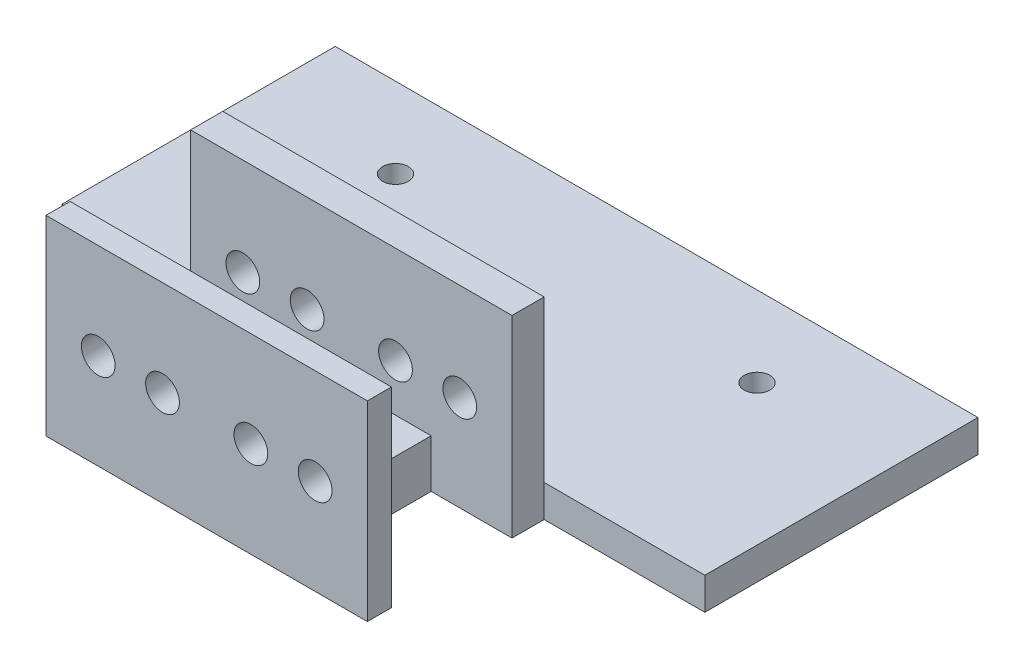
ISO-10303-21;
HEADER;
FILE_DESCRIPTION(('STEP AP214'),'2;1');
FILE_NAME('part.step','',(''),(''),'','','');
FILE_SCHEMA(('AUTOMOTIVE_DESIGN { 1 0 10303 214 1 1 1 1 }'));
ENDSEC;
DATA;
#1=APPLICATION_CONTEXT('core data for automotive mechanical design processes');
#2=APPLICATION_PROTOCOL_DEFINITION('international standard','automotive_design',2000,#1);
#3=PRODUCT_CONTEXT('',#1,'mechanical');
#4=PRODUCT('Part','Part','',(#3));
#5=PRODUCT_RELATED_PRODUCT_CATEGORY('part','',(#4));
#6=PRODUCT_DEFINITION_FORMATION('','',#4);
#7=PRODUCT_DEFINITION_CONTEXT('part definition',#1,'design');
#8=PRODUCT_DEFINITION('design','',#6,#7);
#9=PRODUCT_DEFINITION_SHAPE('','',#8);
#10=(LENGTH_UNIT() NAMED_UNIT(*) SI_UNIT(.MILLI.,.METRE.));
#11=(NAMED_UNIT(*) PLANE_ANGLE_UNIT() SI_UNIT($,.RADIAN.));
#12=(NAMED_UNIT(*) SI_UNIT($,.STERADIAN.) SOLID_ANGLE_UNIT());
#13=UNCERTAINTY_MEASURE_WITH_UNIT(LENGTH_MEASURE(1.E-05),#10,'distance_accuracy_value','');
#14=(GEOMETRIC_REPRESENTATION_CONTEXT(3) GLOBAL_UNCERTAINTY_ASSIGNED_CONTEXT((#13)) GLOBAL_UNIT_ASSIGNED_CONTEXT((#10,
#11,#12)) REPRESENTATION_CONTEXT('',''));
#15=CARTESIAN_POINT('',(0.,0.,0.));
#16=DIRECTION('',(0.,0.,1.));
#17=DIRECTION('',(1.,0.,0.));
#18=AXIS2_PLACEMENT_3D('',#15,#16,#17);
#19=CARTESIAN_POINT('',(0.,0.,21.));
#20=DIRECTION('',(0.,0.,-1.));
#21=DIRECTION('',(-1.,0.,0.));
#22=AXIS2_PLACEMENT_3D('',#19,#20,#21);
#23=PLANE('',#22);
#24=CARTESIAN_POINT('',(-13.5,11.8953133982025,21.));
#25=DIRECTION('',(0.,0.,-1.));
#26=DIRECTION('',(-1.,0.,0.));
#27=AXIS2_PLACEMENT_3D('',#24,#25,#26);
#28=CIRCLE('',#27,2.1);
#29=CARTESIAN_POINT('',(-15.6,11.8953133982025,21.));
#30=VERTEX_POINT('',#29);
#31=EDGE_CURVE('E317',#30,#30,#28,.T.);
#32=ORIENTED_EDGE('',*,*,#31,.T.);
#33=EDGE_LOOP('',(#32));
#34=FACE_BOUND('',#33,.T.);
#35=CARTESIAN_POINT('',(-5.50000000000001,11.8953133982025,21.));
#36=DIRECTION('',(0.,0.,-1.));
#37=DIRECTION('',(-1.,0.,0.));
#38=AXIS2_PLACEMENT_3D('',#35,#36,#37);
#39=CIRCLE('',#38,2.1);
#40=CARTESIAN_POINT('',(-7.60000000000001,11.8953133982025,21.));
#41=VERTEX_POINT('',#40);
#42=EDGE_CURVE('E305',#41,#41,#39,.T.);
#43=ORIENTED_EDGE('',*,*,#42,.T.);
#44=EDGE_LOOP('',(#43));
#45=FACE_BOUND('',#44,.T.);
#46=CARTESIAN_POINT('',(5.49999999999999,11.8953133982025,21.));
#47=DIRECTION('',(0.,0.,-1.));
#48=DIRECTION('',(-1.,0.,0.));
#49=AXIS2_PLACEMENT_3D('',#46,#47,#48);
#50=CIRCLE('',#49,2.1);
#51=CARTESIAN_POINT('',(3.39999999999999,11.8953133982025,21.));
#52=VERTEX_POINT('',#51);
#53=EDGE_CURVE('E302',#52,#52,#50,.T.);
#54=ORIENTED_EDGE('',*,*,#53,.T.);
#55=EDGE_LOOP('',(#54));
#56=FACE_BOUND('',#55,.T.);
#57=CARTESIAN_POINT('',(13.5,11.8953133982025,21.));
#58=DIRECTION('',(0.,0.,-1.));
#59=DIRECTION('',(-1.,0.,0.));
#60=AXIS2_PLACEMENT_3D('',#57,#58,#59);
#61=CIRCLE('',#60,2.1);
#62=CARTESIAN_POINT('',(11.4,11.8953133982025,21.));
#63=VERTEX_POINT('',#62);
#64=EDGE_CURVE('E298',#63,#63,#61,.T.);
#65=ORIENTED_EDGE('',*,*,#64,.T.);
#66=EDGE_LOOP('',(#65));
#67=FACE_BOUND('',#66,.T.);
#68=DIRECTION('',(0.,1.,0.));
#69=VECTOR('',#68,1.);
#70=CARTESIAN_POINT('',(9.93801246310932,6.,21.));
#71=LINE('',#70,#69);
#72=CARTESIAN_POINT('',(9.93801246310932,0.,21.));
#73=VERTEX_POINT('',#72);
#74=CARTESIAN_POINT('',(9.93801246310932,6.,21.));
#75=VERTEX_POINT('',#74);
#76=EDGE_CURVE('E66',#73,#75,#71,.T.);
#77=ORIENTED_EDGE('',*,*,#76,.F.);
#78=DIRECTION('',(1.,0.,0.));
#79=VECTOR('',#78,1.);
#80=CARTESIAN_POINT('',(-20.,0.,21.));
#81=LINE('',#80,#79);
#82=CARTESIAN_POINT('',(20.,0.,21.));
#83=VERTEX_POINT('',#82);
#84=EDGE_CURVE('E224',#73,#83,#81,.T.);
#85=ORIENTED_EDGE('',*,*,#84,.T.);
#86=DIRECTION('',(0.,1.,0.));
#87=VECTOR('',#86,1.);
#88=CARTESIAN_POINT('',(20.,0.,21.));
#89=LINE('',#88,#87);
#90=CARTESIAN_POINT('',(20.,24.,21.));
#91=VERTEX_POINT('',#90);
#92=EDGE_CURVE('E228',#83,#91,#89,.T.);
#93=ORIENTED_EDGE('',*,*,#92,.T.);
#94=DIRECTION('',(-1.,0.,0.));
#95=VECTOR('',#94,1.);
#96=CARTESIAN_POINT('',(-20.,24.,21.));
#97=LINE('',#96,#95);
#98=CARTESIAN_POINT('',(-20.,24.,21.));
#99=VERTEX_POINT('',#98);
#100=EDGE_CURVE('E230',#91,#99,#97,.T.);
#101=ORIENTED_EDGE('',*,*,#100,.T.);
#102=DIRECTION('',(0.,-1.,0.));
#103=VECTOR('',#102,1.);
#104=CARTESIAN_POINT('',(-20.,0.,21.));
#105=LINE('',#104,#103);
#106=CARTESIAN_POINT('',(-20.,0.,21.));
#107=VERTEX_POINT('',#106);
#108=EDGE_CURVE('E221',#99,#107,#105,.T.);
#109=ORIENTED_EDGE('',*,*,#108,.T.);
#110=CARTESIAN_POINT('',(-10.0619875368907,0.,21.));
#111=VERTEX_POINT('',#110);
#112=EDGE_CURVE('E226',#107,#111,#81,.T.);
#113=ORIENTED_EDGE('',*,*,#112,.T.);
#114=DIRECTION('',(0.,-1.,0.));
#115=VECTOR('',#114,1.);
#116=CARTESIAN_POINT('',(-10.0619875368907,6.,21.));
#117=LINE('',#116,#115);
#118=CARTESIAN_POINT('',(-10.0619875368907,6.,21.));
#119=VERTEX_POINT('',#118);
#120=EDGE_CURVE('E201',#119,#111,#117,.T.);
#121=ORIENTED_EDGE('',*,*,#120,.F.);
#122=DIRECTION('',(-1.,0.,0.));
#123=VECTOR('',#122,1.);
#124=CARTESIAN_POINT('',(-10.0619875368907,6.,21.));
#125=LINE('',#124,#123);
#126=EDGE_CURVE('E61',#75,#119,#125,.T.);
#127=ORIENTED_EDGE('',*,*,#126,.F.);
#128=EDGE_LOOP('',(#77,#85,#93,#101,#109,#113,#121,#127));
#129=FACE_BOUND('',#128,.T.);
#130=ADVANCED_FACE('F43',(#34,#45,#56,#67,#129),#23,.F.);
#131=CARTESIAN_POINT('',(-40.,4.,17.));
#132=DIRECTION('',(0.,0.,-1.));
#133=DIRECTION('',(-1.,0.,0.));
#134=AXIS2_PLACEMENT_3D('',#131,#132,#133);
#135=PLANE('',#134);
#136=DIRECTION('',(0.,-1.,0.));
#137=VECTOR('',#136,1.);
#138=CARTESIAN_POINT('',(-20.,0.,17.));
#139=LINE('',#138,#137);
#140=CARTESIAN_POINT('',(-20.,4.,17.));
#141=VERTEX_POINT('',#140);
#142=CARTESIAN_POINT('',(-20.,0.,17.));
#143=VERTEX_POINT('',#142);
#144=EDGE_CURVE('E11',#141,#143,#139,.T.);
#145=ORIENTED_EDGE('',*,*,#144,.F.);
#146=DIRECTION('',(1.,0.,0.));
#147=VECTOR('',#146,1.);
#148=CARTESIAN_POINT('',(-40.,4.,17.));
#149=LINE('',#148,#147);
#150=CARTESIAN_POINT('',(-40.,4.,17.));
#151=VERTEX_POINT('',#150);
#152=EDGE_CURVE('E272',#151,#141,#149,.T.);
#153=ORIENTED_EDGE('',*,*,#152,.F.);
#154=DIRECTION('',(0.,-1.,0.));
#155=VECTOR('',#154,1.);
#156=CARTESIAN_POINT('',(-40.,4.,17.));
#157=LINE('',#156,#155);
#158=CARTESIAN_POINT('',(-40.,0.,17.));
#159=VERTEX_POINT('',#158);
#160=EDGE_CURVE('E287',#151,#159,#157,.T.);
#161=ORIENTED_EDGE('',*,*,#160,.T.);
#162=DIRECTION('',(1.,0.,0.));
#163=VECTOR('',#162,1.);
#164=CARTESIAN_POINT('',(-40.,0.,17.));
#165=LINE('',#164,#163);
#166=EDGE_CURVE('E267',#159,#143,#165,.T.);
#167=ORIENTED_EDGE('',*,*,#166,.T.);
#168=EDGE_LOOP('',(#145,#153,#161,#167));
#169=FACE_BOUND('',#168,.T.);
#170=ADVANCED_FACE('F369',(#169),#135,.F.);
#171=DIRECTION('',(0.,1.,0.));
#172=VECTOR('',#171,1.);
#173=CARTESIAN_POINT('',(20.,0.,17.));
#174=LINE('',#173,#172);
#175=CARTESIAN_POINT('',(20.,0.,17.));
#176=VERTEX_POINT('',#175);
#177=CARTESIAN_POINT('',(20.,4.,17.));
#178=VERTEX_POINT('',#177);
#179=EDGE_CURVE('E235',#176,#178,#174,.T.);
#180=ORIENTED_EDGE('',*,*,#179,.F.);
#181=CARTESIAN_POINT('',(40.,0.,17.));
#182=VERTEX_POINT('',#181);
#183=EDGE_CURVE('E283',#176,#182,#165,.T.);
#184=ORIENTED_EDGE('',*,*,#183,.T.);
#185=DIRECTION('',(0.,-1.,0.));
#186=VECTOR('',#185,1.);
#187=CARTESIAN_POINT('',(40.,4.,17.));
#188=LINE('',#187,#186);
#189=CARTESIAN_POINT('',(40.,4.,17.));
#190=VERTEX_POINT('',#189);
#191=EDGE_CURVE('E275',#190,#182,#188,.T.);
#192=ORIENTED_EDGE('',*,*,#191,.F.);
#193=EDGE_CURVE('E271',#178,#190,#149,.T.);
#194=ORIENTED_EDGE('',*,*,#193,.F.);
#195=EDGE_LOOP('',(#180,#184,#192,#194));
#196=FACE_BOUND('',#195,.T.);
#197=ADVANCED_FACE('F384',(#196),#135,.F.);
#198=CARTESIAN_POINT('',(40.,4.,-17.));
#199=DIRECTION('',(-1.,0.,0.));
#200=DIRECTION('',(0.,0.,1.));
#201=AXIS2_PLACEMENT_3D('',#198,#199,#200);
#202=PLANE('',#201);
#203=DIRECTION('',(0.,0.,-1.));
#204=VECTOR('',#203,1.);
#205=CARTESIAN_POINT('',(40.,0.,-17.));
#206=LINE('',#205,#204);
#207=CARTESIAN_POINT('',(40.,0.,-17.));
#208=VERTEX_POINT('',#207);
#209=EDGE_CURVE('E258',#182,#208,#206,.T.);
#210=ORIENTED_EDGE('',*,*,#209,.T.);
#211=DIRECTION('',(0.,-1.,0.));
#212=VECTOR('',#211,1.);
#213=CARTESIAN_POINT('',(40.,4.,-17.));
#214=LINE('',#213,#212);
#215=CARTESIAN_POINT('',(40.,4.,-17.));
#216=VERTEX_POINT('',#215);
#217=EDGE_CURVE('E52',#216,#208,#214,.T.);
#218=ORIENTED_EDGE('',*,*,#217,.F.);
#219=DIRECTION('',(0.,0.,-1.));
#220=VECTOR('',#219,1.);
#221=CARTESIAN_POINT('',(40.,4.,-17.));
#222=LINE('',#221,#220);
#223=EDGE_CURVE('E263',#190,#216,#222,.T.);
#224=ORIENTED_EDGE('',*,*,#223,.F.);
#225=ORIENTED_EDGE('',*,*,#191,.T.);
#226=EDGE_LOOP('',(#210,#218,#224,#225));
#227=FACE_BOUND('',#226,.T.);
#228=ADVANCED_FACE('F45',(#227),#202,.F.);
#229=CARTESIAN_POINT('',(-40.,4.,-17.));
#230=DIRECTION('',(0.,0.,1.));
#231=DIRECTION('',(1.,0.,0.));
#232=AXIS2_PLACEMENT_3D('',#229,#230,#231);
#233=PLANE('',#232);
#234=DIRECTION('',(-1.,0.,0.));
#235=VECTOR('',#234,1.);
#236=CARTESIAN_POINT('',(-40.,0.,-17.));
#237=LINE('',#236,#235);
#238=CARTESIAN_POINT('',(-40.,0.,-17.));
#239=VERTEX_POINT('',#238);
#240=EDGE_CURVE('E279',#208,#239,#237,.T.);
#241=ORIENTED_EDGE('',*,*,#240,.T.);
#242=DIRECTION('',(0.,-1.,0.));
#243=VECTOR('',#242,1.);
#244=CARTESIAN_POINT('',(-40.,4.,-17.));
#245=LINE('',#244,#243);
#246=CARTESIAN_POINT('',(-40.,4.,-17.));
#247=VERTEX_POINT('',#246);
#248=EDGE_CURVE('E290',#247,#239,#245,.T.);
#249=ORIENTED_EDGE('',*,*,#248,.F.);
#250=DIRECTION('',(-1.,0.,0.));
#251=VECTOR('',#250,1.);
#252=CARTESIAN_POINT('',(-40.,4.,-17.));
#253=LINE('',#252,#251);
#254=EDGE_CURVE('E266',#216,#247,#253,.T.);
#255=ORIENTED_EDGE('',*,*,#254,.F.);
#256=ORIENTED_EDGE('',*,*,#217,.T.);
#257=EDGE_LOOP('',(#241,#249,#255,#256));
#258=FACE_BOUND('',#257,.T.);
#259=ADVANCED_FACE('F377',(#258),#233,.F.);
#260=CARTESIAN_POINT('',(-40.,4.,-17.));
#261=DIRECTION('',(1.,0.,0.));
#262=DIRECTION('',(0.,0.,-1.));
#263=AXIS2_PLACEMENT_3D('',#260,#261,#262);
#264=PLANE('',#263);
#265=DIRECTION('',(0.,0.,1.));
#266=VECTOR('',#265,1.);
#267=CARTESIAN_POINT('',(-40.,0.,-17.));
#268=LINE('',#267,#266);
#269=EDGE_CURVE('E281',#239,#159,#268,.T.);
#270=ORIENTED_EDGE('',*,*,#269,.T.);
#271=ORIENTED_EDGE('',*,*,#160,.F.);
#272=DIRECTION('',(0.,0.,1.));
#273=VECTOR('',#272,1.);
#274=CARTESIAN_POINT('',(-40.,4.,-17.));
#275=LINE('',#274,#273);
#276=EDGE_CURVE('E269',#247,#151,#275,.T.);
#277=ORIENTED_EDGE('',*,*,#276,.F.);
#278=ORIENTED_EDGE('',*,*,#248,.T.);
#279=EDGE_LOOP('',(#270,#271,#277,#278));
#280=FACE_BOUND('',#279,.T.);
#281=ADVANCED_FACE('F374',(#280),#264,.F.);
#282=CARTESIAN_POINT('',(0.,4.,0.));
#283=DIRECTION('',(0.,1.,0.));
#284=DIRECTION('',(0.,0.,1.));
#285=AXIS2_PLACEMENT_3D('',#282,#283,#284);
#286=PLANE('',#285);
#287=CARTESIAN_POINT('',(-22.5,4.,-7.00000000000001));
#288=DIRECTION('',(0.,1.,0.));
#289=DIRECTION('',(0.,0.,1.));
#290=AXIS2_PLACEMENT_3D('',#287,#288,#289);
#291=CIRCLE('',#290,1.6);
#292=CARTESIAN_POINT('',(-22.5,4.,-5.4));
#293=VERTEX_POINT('',#292);
#294=EDGE_CURVE('E251',#293,#293,#291,.T.);
#295=ORIENTED_EDGE('',*,*,#294,.F.);
#296=EDGE_LOOP('',(#295));
#297=FACE_BOUND('',#296,.T.);
#298=CARTESIAN_POINT('',(22.5,4.,-7.00000000000001));
#299=DIRECTION('',(0.,1.,0.));
#300=DIRECTION('',(0.,0.,1.));
#301=AXIS2_PLACEMENT_3D('',#298,#299,#300);
#302=CIRCLE('',#301,1.6);
#303=CARTESIAN_POINT('',(22.5,4.,-5.4));
#304=VERTEX_POINT('',#303);
#305=EDGE_CURVE('E255',#304,#304,#302,.T.);
#306=ORIENTED_EDGE('',*,*,#305,.F.);
#307=EDGE_LOOP('',(#306));
#308=FACE_BOUND('',#307,.T.);
#309=ORIENTED_EDGE('',*,*,#223,.T.);
#310=ORIENTED_EDGE('',*,*,#254,.T.);
#311=ORIENTED_EDGE('',*,*,#276,.T.);
#312=ORIENTED_EDGE('',*,*,#152,.T.);
#313=EDGE_CURVE('E276',#141,#178,#149,.T.);
#314=ORIENTED_EDGE('',*,*,#313,.T.);
#315=ORIENTED_EDGE('',*,*,#193,.T.);
#316=EDGE_LOOP('',(#309,#310,#311,#312,#314,#315));
#317=FACE_BOUND('',#316,.T.);
#318=ADVANCED_FACE('F389',(#297,#308,#317),#286,.T.);
#319=CARTESIAN_POINT('',(0.,0.,0.));
#320=DIRECTION('',(0.,1.,0.));
#321=DIRECTION('',(0.,0.,1.));
#322=AXIS2_PLACEMENT_3D('',#319,#320,#321);
#323=PLANE('',#322);
#324=CARTESIAN_POINT('',(-22.5,0.,-7.00000000000001));
#325=DIRECTION('',(0.,1.,0.));
#326=DIRECTION('',(0.,0.,1.));
#327=AXIS2_PLACEMENT_3D('',#324,#325,#326);
#328=CIRCLE('',#327,1.6);
#329=CARTESIAN_POINT('',(-22.5,0.,-5.4));
#330=VERTEX_POINT('',#329);
#331=EDGE_CURVE('E254',#330,#330,#328,.F.);
#332=ORIENTED_EDGE('',*,*,#331,.F.);
#333=EDGE_LOOP('',(#332));
#334=FACE_BOUND('',#333,.T.);
#335=CARTESIAN_POINT('',(22.5,0.,-7.00000000000001));
#336=DIRECTION('',(0.,1.,0.));
#337=DIRECTION('',(0.,0.,1.));
#338=AXIS2_PLACEMENT_3D('',#335,#336,#337);
#339=CIRCLE('',#338,1.6);
#340=CARTESIAN_POINT('',(22.5,0.,-5.4));
#341=VERTEX_POINT('',#340);
#342=EDGE_CURVE('E250',#341,#341,#339,.F.);
#343=ORIENTED_EDGE('',*,*,#342,.F.);
#344=EDGE_LOOP('',(#343));
#345=FACE_BOUND('',#344,.T.);
#346=ORIENTED_EDGE('',*,*,#209,.F.);
#347=ORIENTED_EDGE('',*,*,#183,.F.);
#348=DIRECTION('',(0.,0.,-1.));
#349=VECTOR('',#348,1.);
#350=CARTESIAN_POINT('',(20.,0.,21.));
#351=LINE('',#350,#349);
#352=EDGE_CURVE('E244',#83,#176,#351,.T.);
#353=ORIENTED_EDGE('',*,*,#352,.F.);
#354=ORIENTED_EDGE('',*,*,#84,.F.);
#355=DIRECTION('',(0.,0.,-1.));
#356=VECTOR('',#355,1.);
#357=CARTESIAN_POINT('',(9.93801246310932,0.,36.));
#358=LINE('',#357,#356);
#359=CARTESIAN_POINT('',(9.93801246310932,0.,36.));
#360=VERTEX_POINT('',#359);
#361=EDGE_CURVE('E206',#360,#73,#358,.T.);
#362=ORIENTED_EDGE('',*,*,#361,.F.);
#363=DIRECTION('',(1.,0.,0.));
#364=VECTOR('',#363,1.);
#365=CARTESIAN_POINT('',(-20.,0.,36.));
#366=LINE('',#365,#364);
#367=CARTESIAN_POINT('',(20.,0.,36.));
#368=VERTEX_POINT('',#367);
#369=EDGE_CURVE('E324',#360,#368,#366,.T.);
#370=ORIENTED_EDGE('',*,*,#369,.T.);
#371=DIRECTION('',(0.,0.,-1.));
#372=VECTOR('',#371,1.);
#373=CARTESIAN_POINT('',(20.,0.,39.));
#374=LINE('',#373,#372);
#375=CARTESIAN_POINT('',(20.,0.,39.));
#376=VERTEX_POINT('',#375);
#377=EDGE_CURVE('E173',#376,#368,#374,.T.);
#378=ORIENTED_EDGE('',*,*,#377,.F.);
#379=DIRECTION('',(1.,0.,0.));
#380=VECTOR('',#379,1.);
#381=CARTESIAN_POINT('',(-20.,0.,39.));
#382=LINE('',#381,#380);
#383=CARTESIAN_POINT('',(-20.,0.,39.));
#384=VERTEX_POINT('',#383);
#385=EDGE_CURVE('E164',#384,#376,#382,.T.);
#386=ORIENTED_EDGE('',*,*,#385,.F.);
#387=DIRECTION('',(0.,0.,-1.));
#388=VECTOR('',#387,1.);
#389=CARTESIAN_POINT('',(-20.,0.,39.));
#390=LINE('',#389,#388);
#391=CARTESIAN_POINT('',(-20.,0.,36.));
#392=VERTEX_POINT('',#391);
#393=EDGE_CURVE('E170',#384,#392,#390,.T.);
#394=ORIENTED_EDGE('',*,*,#393,.T.);
#395=CARTESIAN_POINT('',(-10.0619875368907,0.,36.));
#396=VERTEX_POINT('',#395);
#397=EDGE_CURVE('E325',#392,#396,#366,.T.);
#398=ORIENTED_EDGE('',*,*,#397,.T.);
#399=DIRECTION('',(0.,0.,-1.));
#400=VECTOR('',#399,1.);
#401=CARTESIAN_POINT('',(-10.0619875368907,0.,36.));
#402=LINE('',#401,#400);
#403=EDGE_CURVE('E213',#396,#111,#402,.T.);
#404=ORIENTED_EDGE('',*,*,#403,.T.);
#405=ORIENTED_EDGE('',*,*,#112,.F.);
#406=DIRECTION('',(0.,0.,-1.));
#407=VECTOR('',#406,1.);
#408=CARTESIAN_POINT('',(-20.,0.,21.));
#409=LINE('',#408,#407);
#410=EDGE_CURVE('E247',#107,#143,#409,.T.);
#411=ORIENTED_EDGE('',*,*,#410,.T.);
#412=ORIENTED_EDGE('',*,*,#166,.F.);
#413=ORIENTED_EDGE('',*,*,#269,.F.);
#414=ORIENTED_EDGE('',*,*,#240,.F.);
#415=EDGE_LOOP('',(#346,#347,#353,#354,#362,#370,#378,#386,#394,#398,#404,#405,#411,#412,#413,#414));
#416=FACE_BOUND('',#415,.T.);
#417=ADVANCED_FACE('F167',(#334,#345,#416),#323,.F.);
#418=CARTESIAN_POINT('',(22.5,-0.00100000000000013,-7.00000000000001));
#419=DIRECTION('',(0.,1.,0.));
#420=DIRECTION('',(0.,0.,1.));
#421=AXIS2_PLACEMENT_3D('',#418,#419,#420);
#422=CYLINDRICAL_SURFACE('',#421,1.6);
#423=ORIENTED_EDGE('',*,*,#305,.T.);
#424=EDGE_LOOP('',(#423));
#425=FACE_BOUND('',#424,.T.);
#426=ORIENTED_EDGE('',*,*,#342,.T.);
#427=EDGE_LOOP('',(#426));
#428=FACE_BOUND('',#427,.T.);
#429=ADVANCED_FACE('F398',(#425,#428),#422,.F.);
#430=CARTESIAN_POINT('',(-22.5,-0.00100000000000013,-7.00000000000001));
#431=DIRECTION('',(0.,1.,0.));
#432=DIRECTION('',(0.,0.,1.));
#433=AXIS2_PLACEMENT_3D('',#430,#431,#432);
#434=CYLINDRICAL_SURFACE('',#433,1.6);
#435=ORIENTED_EDGE('',*,*,#294,.T.);
#436=EDGE_LOOP('',(#435));
#437=FACE_BOUND('',#436,.T.);
#438=ORIENTED_EDGE('',*,*,#331,.T.);
#439=EDGE_LOOP('',(#438));
#440=FACE_BOUND('',#439,.T.);
#441=ADVANCED_FACE('F420',(#437,#440),#434,.F.);
#442=CARTESIAN_POINT('',(0.,0.,17.));
#443=DIRECTION('',(0.,0.,-1.));
#444=DIRECTION('',(-1.,0.,0.));
#445=AXIS2_PLACEMENT_3D('',#442,#443,#444);
#446=PLANE('',#445);
#447=CARTESIAN_POINT('',(-13.5,11.8953133982025,17.));
#448=DIRECTION('',(0.,0.,-1.));
#449=DIRECTION('',(-1.,0.,0.));
#450=AXIS2_PLACEMENT_3D('',#447,#448,#449);
#451=CIRCLE('',#450,2.1);
#452=CARTESIAN_POINT('',(-15.6,11.8953133982025,17.));
#453=VERTEX_POINT('',#452);
#454=EDGE_CURVE('E299',#453,#453,#451,.F.);
#455=ORIENTED_EDGE('',*,*,#454,.T.);
#456=EDGE_LOOP('',(#455));
#457=FACE_BOUND('',#456,.T.);
#458=CARTESIAN_POINT('',(-5.50000000000001,11.8953133982025,17.));
#459=DIRECTION('',(0.,0.,-1.));
#460=DIRECTION('',(-1.,0.,0.));
#461=AXIS2_PLACEMENT_3D('',#458,#459,#460);
#462=CIRCLE('',#461,2.1);
#463=CARTESIAN_POINT('',(-7.60000000000001,11.8953133982025,17.));
#464=VERTEX_POINT('',#463);
#465=EDGE_CURVE('E666',#464,#464,#462,.F.);
#466=ORIENTED_EDGE('',*,*,#465,.T.);
#467=EDGE_LOOP('',(#466));
#468=FACE_BOUND('',#467,.T.);
#469=CARTESIAN_POINT('',(5.49999999999999,11.8953133982025,17.));
#470=DIRECTION('',(0.,0.,-1.));
#471=DIRECTION('',(-1.,0.,0.));
#472=AXIS2_PLACEMENT_3D('',#469,#470,#471);
#473=CIRCLE('',#472,2.1);
#474=CARTESIAN_POINT('',(3.39999999999999,11.8953133982025,17.));
#475=VERTEX_POINT('',#474);
#476=EDGE_CURVE('E672',#475,#475,#473,.F.);
#477=ORIENTED_EDGE('',*,*,#476,.T.);
#478=EDGE_LOOP('',(#477));
#479=FACE_BOUND('',#478,.T.);
#480=CARTESIAN_POINT('',(13.5,11.8953133982025,17.));
#481=DIRECTION('',(0.,0.,-1.));
#482=DIRECTION('',(-1.,0.,0.));
#483=AXIS2_PLACEMENT_3D('',#480,#481,#482);
#484=CIRCLE('',#483,2.1);
#485=CARTESIAN_POINT('',(11.4,11.8953133982025,17.));
#486=VERTEX_POINT('',#485);
#487=EDGE_CURVE('E678',#486,#486,#484,.F.);
#488=ORIENTED_EDGE('',*,*,#487,.T.);
#489=EDGE_LOOP('',(#488));
#490=FACE_BOUND('',#489,.T.);
#491=ORIENTED_EDGE('',*,*,#313,.F.);
#492=CARTESIAN_POINT('',(-20.,24.,17.));
#493=VERTEX_POINT('',#492);
#494=EDGE_CURVE('E54',#493,#141,#139,.T.);
#495=ORIENTED_EDGE('',*,*,#494,.F.);
#496=DIRECTION('',(-1.,0.,0.));
#497=VECTOR('',#496,1.);
#498=CARTESIAN_POINT('',(-20.,24.,17.));
#499=LINE('',#498,#497);
#500=CARTESIAN_POINT('',(20.,24.,17.));
#501=VERTEX_POINT('',#500);
#502=EDGE_CURVE('E225',#501,#493,#499,.T.);
#503=ORIENTED_EDGE('',*,*,#502,.F.);
#504=EDGE_CURVE('E234',#178,#501,#174,.T.);
#505=ORIENTED_EDGE('',*,*,#504,.F.);
#506=EDGE_LOOP('',(#491,#495,#503,#505));
#507=FACE_BOUND('',#506,.T.);
#508=ADVANCED_FACE('F388',(#457,#468,#479,#490,#507),#446,.T.);
#509=CARTESIAN_POINT('',(-20.,0.,21.));
#510=DIRECTION('',(1.,0.,0.));
#511=DIRECTION('',(0.,1.,0.));
#512=AXIS2_PLACEMENT_3D('',#509,#510,#511);
#513=PLANE('',#512);
#514=ORIENTED_EDGE('',*,*,#494,.T.);
#515=ORIENTED_EDGE('',*,*,#144,.T.);
#516=ORIENTED_EDGE('',*,*,#410,.F.);
#517=ORIENTED_EDGE('',*,*,#108,.F.);
#518=DIRECTION('',(0.,0.,-1.));
#519=VECTOR('',#518,1.);
#520=CARTESIAN_POINT('',(-20.,24.,21.));
#521=LINE('',#520,#519);
#522=EDGE_CURVE('E231',#99,#493,#521,.T.);
#523=ORIENTED_EDGE('',*,*,#522,.T.);
#524=EDGE_LOOP('',(#514,#515,#516,#517,#523));
#525=FACE_BOUND('',#524,.T.);
#526=ADVANCED_FACE('F365',(#525),#513,.F.);
#527=CARTESIAN_POINT('',(20.,0.,21.));
#528=DIRECTION('',(-1.,0.,0.));
#529=DIRECTION('',(0.,-1.,0.));
#530=AXIS2_PLACEMENT_3D('',#527,#528,#529);
#531=PLANE('',#530);
#532=ORIENTED_EDGE('',*,*,#179,.T.);
#533=ORIENTED_EDGE('',*,*,#504,.T.);
#534=DIRECTION('',(0.,0.,-1.));
#535=VECTOR('',#534,1.);
#536=CARTESIAN_POINT('',(20.,24.,21.));
#537=LINE('',#536,#535);
#538=EDGE_CURVE('E241',#91,#501,#537,.T.);
#539=ORIENTED_EDGE('',*,*,#538,.F.);
#540=ORIENTED_EDGE('',*,*,#92,.F.);
#541=ORIENTED_EDGE('',*,*,#352,.T.);
#542=EDGE_LOOP('',(#532,#533,#539,#540,#541));
#543=FACE_BOUND('',#542,.T.);
#544=ADVANCED_FACE('F356',(#543),#531,.F.);
#545=CARTESIAN_POINT('',(-20.,24.,21.));
#546=DIRECTION('',(0.,-1.,0.));
#547=DIRECTION('',(0.,0.,-1.));
#548=AXIS2_PLACEMENT_3D('',#545,#546,#547);
#549=PLANE('',#548);
#550=ORIENTED_EDGE('',*,*,#502,.T.);
#551=ORIENTED_EDGE('',*,*,#522,.F.);
#552=ORIENTED_EDGE('',*,*,#100,.F.);
#553=ORIENTED_EDGE('',*,*,#538,.T.);
#554=EDGE_LOOP('',(#550,#551,#552,#553));
#555=FACE_BOUND('',#554,.T.);
#556=ADVANCED_FACE('F360',(#555),#549,.F.);
#557=CARTESIAN_POINT('',(9.93801246310932,6.,36.));
#558=DIRECTION('',(-1.,0.,0.));
#559=DIRECTION('',(0.,0.,1.));
#560=AXIS2_PLACEMENT_3D('',#557,#558,#559);
#561=PLANE('',#560);
#562=ORIENTED_EDGE('',*,*,#76,.T.);
#563=DIRECTION('',(0.,0.,-1.));
#564=VECTOR('',#563,1.);
#565=CARTESIAN_POINT('',(9.93801246310932,6.,36.));
#566=LINE('',#565,#564);
#567=CARTESIAN_POINT('',(9.93801246310932,6.,36.));
#568=VERTEX_POINT('',#567);
#569=EDGE_CURVE('E219',#568,#75,#566,.T.);
#570=ORIENTED_EDGE('',*,*,#569,.F.);
#571=DIRECTION('',(0.,1.,0.));
#572=VECTOR('',#571,1.);
#573=CARTESIAN_POINT('',(9.93801246310932,6.,36.));
#574=LINE('',#573,#572);
#575=EDGE_CURVE('E197',#360,#568,#574,.T.);
#576=ORIENTED_EDGE('',*,*,#575,.F.);
#577=ORIENTED_EDGE('',*,*,#361,.T.);
#578=EDGE_LOOP('',(#562,#570,#576,#577));
#579=FACE_BOUND('',#578,.T.);
#580=ADVANCED_FACE('F348',(#579),#561,.F.);
#581=CARTESIAN_POINT('',(-10.0619875368907,6.,36.));
#582=DIRECTION('',(0.,-1.,0.));
#583=DIRECTION('',(0.,0.,-1.));
#584=AXIS2_PLACEMENT_3D('',#581,#582,#583);
#585=PLANE('',#584);
#586=ORIENTED_EDGE('',*,*,#126,.T.);
#587=DIRECTION('',(0.,0.,-1.));
#588=VECTOR('',#587,1.);
#589=CARTESIAN_POINT('',(-10.0619875368907,6.,36.));
#590=LINE('',#589,#588);
#591=CARTESIAN_POINT('',(-10.0619875368907,6.,36.));
#592=VERTEX_POINT('',#591);
#593=EDGE_CURVE('E216',#592,#119,#590,.T.);
#594=ORIENTED_EDGE('',*,*,#593,.F.);
#595=DIRECTION('',(-1.,0.,0.));
#596=VECTOR('',#595,1.);
#597=CARTESIAN_POINT('',(-10.0619875368907,6.,36.));
#598=LINE('',#597,#596);
#599=EDGE_CURVE('E200',#568,#592,#598,.T.);
#600=ORIENTED_EDGE('',*,*,#599,.F.);
#601=ORIENTED_EDGE('',*,*,#569,.T.);
#602=EDGE_LOOP('',(#586,#594,#600,#601));
#603=FACE_BOUND('',#602,.T.);
#604=ADVANCED_FACE('F344',(#603),#585,.F.);
#605=CARTESIAN_POINT('',(-10.0619875368907,6.,36.));
#606=DIRECTION('',(1.,0.,0.));
#607=DIRECTION('',(0.,1.,0.));
#608=AXIS2_PLACEMENT_3D('',#605,#606,#607);
#609=PLANE('',#608);
#610=ORIENTED_EDGE('',*,*,#120,.T.);
#611=ORIENTED_EDGE('',*,*,#403,.F.);
#612=DIRECTION('',(0.,-1.,0.));
#613=VECTOR('',#612,1.);
#614=CARTESIAN_POINT('',(-10.0619875368907,6.,36.));
#615=LINE('',#614,#613);
#616=EDGE_CURVE('E204',#592,#396,#615,.T.);
#617=ORIENTED_EDGE('',*,*,#616,.F.);
#618=ORIENTED_EDGE('',*,*,#593,.T.);
#619=EDGE_LOOP('',(#610,#611,#617,#618));
#620=FACE_BOUND('',#619,.T.);
#621=ADVANCED_FACE('F342',(#620),#609,.F.);
#622=CARTESIAN_POINT('',(-20.,0.,39.));
#623=DIRECTION('',(1.,0.,0.));
#624=DIRECTION('',(0.,0.,-1.));
#625=AXIS2_PLACEMENT_3D('',#622,#623,#624);
#626=PLANE('',#625);
#627=DIRECTION('',(0.,-1.,0.));
#628=VECTOR('',#627,1.);
#629=CARTESIAN_POINT('',(-20.,0.,36.));
#630=LINE('',#629,#628);
#631=CARTESIAN_POINT('',(-20.,23.790626796405,36.));
#632=VERTEX_POINT('',#631);
#633=EDGE_CURVE('E190',#632,#392,#630,.T.);
#634=ORIENTED_EDGE('',*,*,#633,.T.);
#635=ORIENTED_EDGE('',*,*,#393,.F.);
#636=DIRECTION('',(0.,-1.,0.));
#637=VECTOR('',#636,1.);
#638=CARTESIAN_POINT('',(-20.,0.,39.));
#639=LINE('',#638,#637);
#640=CARTESIAN_POINT('',(-20.,23.790626796405,39.));
#641=VERTEX_POINT('',#640);
#642=EDGE_CURVE('E177',#641,#384,#639,.T.);
#643=ORIENTED_EDGE('',*,*,#642,.F.);
#644=DIRECTION('',(0.,0.,-1.));
#645=VECTOR('',#644,1.);
#646=CARTESIAN_POINT('',(-20.,23.790626796405,39.));
#647=LINE('',#646,#645);
#648=EDGE_CURVE('E322',#641,#632,#647,.T.);
#649=ORIENTED_EDGE('',*,*,#648,.T.);
#650=EDGE_LOOP('',(#634,#635,#643,#649));
#651=FACE_BOUND('',#650,.T.);
#652=ADVANCED_FACE('F188',(#651),#626,.F.);
#653=CARTESIAN_POINT('',(20.,0.,39.));
#654=DIRECTION('',(-1.,0.,0.));
#655=DIRECTION('',(0.,0.,1.));
#656=AXIS2_PLACEMENT_3D('',#653,#654,#655);
#657=PLANE('',#656);
#658=DIRECTION('',(0.,1.,0.));
#659=VECTOR('',#658,1.);
#660=CARTESIAN_POINT('',(20.,0.,36.));
#661=LINE('',#660,#659);
#662=CARTESIAN_POINT('',(20.,23.790626796405,36.));
#663=VERTEX_POINT('',#662);
#664=EDGE_CURVE('E327',#368,#663,#661,.T.);
#665=ORIENTED_EDGE('',*,*,#664,.T.);
#666=DIRECTION('',(0.,0.,-1.));
#667=VECTOR('',#666,1.);
#668=CARTESIAN_POINT('',(20.,23.790626796405,39.));
#669=LINE('',#668,#667);
#670=CARTESIAN_POINT('',(20.,23.790626796405,39.));
#671=VERTEX_POINT('',#670);
#672=EDGE_CURVE('E193',#671,#663,#669,.T.);
#673=ORIENTED_EDGE('',*,*,#672,.F.);
#674=DIRECTION('',(0.,1.,0.));
#675=VECTOR('',#674,1.);
#676=CARTESIAN_POINT('',(20.,0.,39.));
#677=LINE('',#676,#675);
#678=EDGE_CURVE('E176',#376,#671,#677,.T.);
#679=ORIENTED_EDGE('',*,*,#678,.F.);
#680=ORIENTED_EDGE('',*,*,#377,.T.);
#681=EDGE_LOOP('',(#665,#673,#679,#680));
#682=FACE_BOUND('',#681,.T.);
#683=ADVANCED_FACE('F548',(#682),#657,.F.);
#684=CARTESIAN_POINT('',(-20.,23.790626796405,39.));
#685=DIRECTION('',(0.,-1.,0.));
#686=DIRECTION('',(0.,0.,-1.));
#687=AXIS2_PLACEMENT_3D('',#684,#685,#686);
#688=PLANE('',#687);
#689=DIRECTION('',(-1.,0.,0.));
#690=VECTOR('',#689,1.);
#691=CARTESIAN_POINT('',(-20.,23.790626796405,36.));
#692=LINE('',#691,#690);
#693=EDGE_CURVE('E186',#663,#632,#692,.T.);
#694=ORIENTED_EDGE('',*,*,#693,.T.);
#695=ORIENTED_EDGE('',*,*,#648,.F.);
#696=DIRECTION('',(-1.,0.,0.));
#697=VECTOR('',#696,1.);
#698=CARTESIAN_POINT('',(-20.,23.790626796405,39.));
#699=LINE('',#698,#697);
#700=EDGE_CURVE('E182',#671,#641,#699,.T.);
#701=ORIENTED_EDGE('',*,*,#700,.F.);
#702=ORIENTED_EDGE('',*,*,#672,.T.);
#703=EDGE_LOOP('',(#694,#695,#701,#702));
#704=FACE_BOUND('',#703,.T.);
#705=ADVANCED_FACE('F334',(#704),#688,.F.);
#706=CARTESIAN_POINT('',(0.,0.,39.));
#707=DIRECTION('',(0.,0.,-1.));
#708=DIRECTION('',(-1.,0.,0.));
#709=AXIS2_PLACEMENT_3D('',#706,#707,#708);
#710=PLANE('',#709);
#711=CARTESIAN_POINT('',(-13.5,11.8953133982025,39.));
#712=DIRECTION('',(0.,0.,1.));
#713=DIRECTION('',(1.,0.,0.));
#714=AXIS2_PLACEMENT_3D('',#711,#712,#713);
#715=CIRCLE('',#714,2.1);
#716=CARTESIAN_POINT('',(-11.4,11.8953133982025,39.));
#717=VERTEX_POINT('',#716);
#718=EDGE_CURVE('E660',#717,#717,#715,.T.);
#719=ORIENTED_EDGE('',*,*,#718,.F.);
#720=EDGE_LOOP('',(#719));
#721=FACE_BOUND('',#720,.T.);
#722=CARTESIAN_POINT('',(-5.50000000000001,11.8953133982025,39.));
#723=DIRECTION('',(0.,0.,1.));
#724=DIRECTION('',(1.,0.,0.));
#725=AXIS2_PLACEMENT_3D('',#722,#723,#724);
#726=CIRCLE('',#725,2.1);
#727=CARTESIAN_POINT('',(-3.40000000000001,11.8953133982025,39.));
#728=VERTEX_POINT('',#727);
#729=EDGE_CURVE('E663',#728,#728,#726,.T.);
#730=ORIENTED_EDGE('',*,*,#729,.F.);
#731=EDGE_LOOP('',(#730));
#732=FACE_BOUND('',#731,.T.);
#733=CARTESIAN_POINT('',(5.49999999999999,11.8953133982025,39.));
#734=DIRECTION('',(0.,0.,1.));
#735=DIRECTION('',(1.,0.,0.));
#736=AXIS2_PLACEMENT_3D('',#733,#734,#735);
#737=CIRCLE('',#736,2.1);
#738=CARTESIAN_POINT('',(7.59999999999999,11.8953133982025,39.));
#739=VERTEX_POINT('',#738);
#740=EDGE_CURVE('E669',#739,#739,#737,.T.);
#741=ORIENTED_EDGE('',*,*,#740,.F.);
#742=EDGE_LOOP('',(#741));
#743=FACE_BOUND('',#742,.T.);
#744=CARTESIAN_POINT('',(13.5,11.8953133982025,39.));
#745=DIRECTION('',(0.,0.,1.));
#746=DIRECTION('',(1.,0.,0.));
#747=AXIS2_PLACEMENT_3D('',#744,#745,#746);
#748=CIRCLE('',#747,2.1);
#749=CARTESIAN_POINT('',(15.6,11.8953133982025,39.));
#750=VERTEX_POINT('',#749);
#751=EDGE_CURVE('E675',#750,#750,#748,.T.);
#752=ORIENTED_EDGE('',*,*,#751,.F.);
#753=EDGE_LOOP('',(#752));
#754=FACE_BOUND('',#753,.T.);
#755=ORIENTED_EDGE('',*,*,#642,.T.);
#756=ORIENTED_EDGE('',*,*,#385,.T.);
#757=ORIENTED_EDGE('',*,*,#678,.T.);
#758=ORIENTED_EDGE('',*,*,#700,.T.);
#759=EDGE_LOOP('',(#755,#756,#757,#758));
#760=FACE_BOUND('',#759,.T.);
#761=ADVANCED_FACE('F180',(#721,#732,#743,#754,#760),#710,.F.);
#762=CARTESIAN_POINT('',(0.,0.,36.));
#763=DIRECTION('',(0.,0.,-1.));
#764=DIRECTION('',(-1.,0.,0.));
#765=AXIS2_PLACEMENT_3D('',#762,#763,#764);
#766=PLANE('',#765);
#767=CARTESIAN_POINT('',(-13.5,11.8953133982025,36.));
#768=DIRECTION('',(0.,0.,-1.));
#769=DIRECTION('',(-1.,0.,0.));
#770=AXIS2_PLACEMENT_3D('',#767,#768,#769);
#771=CIRCLE('',#770,2.1);
#772=CARTESIAN_POINT('',(-15.6,11.8953133982025,36.));
#773=VERTEX_POINT('',#772);
#774=EDGE_CURVE('E47',#773,#773,#771,.T.);
#775=ORIENTED_EDGE('',*,*,#774,.F.);
#776=EDGE_LOOP('',(#775));
#777=FACE_BOUND('',#776,.T.);
#778=CARTESIAN_POINT('',(-5.50000000000001,11.8953133982025,36.));
#779=DIRECTION('',(0.,0.,-1.));
#780=DIRECTION('',(-1.,0.,0.));
#781=AXIS2_PLACEMENT_3D('',#778,#779,#780);
#782=CIRCLE('',#781,2.1);
#783=CARTESIAN_POINT('',(-7.60000000000001,11.8953133982025,36.));
#784=VERTEX_POINT('',#783);
#785=EDGE_CURVE('E303',#784,#784,#782,.T.);
#786=ORIENTED_EDGE('',*,*,#785,.F.);
#787=EDGE_LOOP('',(#786));
#788=FACE_BOUND('',#787,.T.);
#789=CARTESIAN_POINT('',(5.49999999999999,11.8953133982025,36.));
#790=DIRECTION('',(0.,0.,-1.));
#791=DIRECTION('',(-1.,0.,0.));
#792=AXIS2_PLACEMENT_3D('',#789,#790,#791);
#793=CIRCLE('',#792,2.1);
#794=CARTESIAN_POINT('',(3.39999999999999,11.8953133982025,36.));
#795=VERTEX_POINT('',#794);
#796=EDGE_CURVE('E300',#795,#795,#793,.T.);
#797=ORIENTED_EDGE('',*,*,#796,.F.);
#798=EDGE_LOOP('',(#797));
#799=FACE_BOUND('',#798,.T.);
#800=CARTESIAN_POINT('',(13.5,11.8953133982025,36.));
#801=DIRECTION('',(0.,0.,-1.));
#802=DIRECTION('',(-1.,0.,0.));
#803=AXIS2_PLACEMENT_3D('',#800,#801,#802);
#804=CIRCLE('',#803,2.1);
#805=CARTESIAN_POINT('',(11.4,11.8953133982025,36.));
#806=VERTEX_POINT('',#805);
#807=EDGE_CURVE('E295',#806,#806,#804,.T.);
#808=ORIENTED_EDGE('',*,*,#807,.F.);
#809=EDGE_LOOP('',(#808));
#810=FACE_BOUND('',#809,.T.);
#811=ORIENTED_EDGE('',*,*,#369,.F.);
#812=ORIENTED_EDGE('',*,*,#575,.T.);
#813=ORIENTED_EDGE('',*,*,#599,.T.);
#814=ORIENTED_EDGE('',*,*,#616,.T.);
#815=ORIENTED_EDGE('',*,*,#397,.F.);
#816=ORIENTED_EDGE('',*,*,#633,.F.);
#817=ORIENTED_EDGE('',*,*,#693,.F.);
#818=ORIENTED_EDGE('',*,*,#664,.F.);
#819=EDGE_LOOP('',(#811,#812,#813,#814,#815,#816,#817,#818));
#820=FACE_BOUND('',#819,.T.);
#821=ADVANCED_FACE('F339',(#777,#788,#799,#810,#820),#766,.T.);
#822=CARTESIAN_POINT('',(13.5,11.8953133982025,11.060303038033));
#823=DIRECTION('',(0.,0.,1.));
#824=DIRECTION('',(1.,0.,0.));
#825=AXIS2_PLACEMENT_3D('',#822,#823,#824);
#826=CYLINDRICAL_SURFACE('',#825,2.1);
#827=ORIENTED_EDGE('',*,*,#807,.T.);
#828=EDGE_LOOP('',(#827));
#829=FACE_BOUND('',#828,.T.);
#830=ORIENTED_EDGE('',*,*,#751,.T.);
#831=EDGE_LOOP('',(#830));
#832=FACE_BOUND('',#831,.T.);
#833=ADVANCED_FACE('F576',(#829,#832),#826,.F.);
#834=CARTESIAN_POINT('',(5.49999999999999,11.8953133982025,11.060303038033));
#835=DIRECTION('',(0.,0.,1.));
#836=DIRECTION('',(1.,0.,0.));
#837=AXIS2_PLACEMENT_3D('',#834,#835,#836);
#838=CYLINDRICAL_SURFACE('',#837,2.1);
#839=ORIENTED_EDGE('',*,*,#796,.T.);
#840=EDGE_LOOP('',(#839));
#841=FACE_BOUND('',#840,.T.);
#842=ORIENTED_EDGE('',*,*,#740,.T.);
#843=EDGE_LOOP('',(#842));
#844=FACE_BOUND('',#843,.T.);
#845=ADVANCED_FACE('F585',(#841,#844),#838,.F.);
#846=CARTESIAN_POINT('',(-5.50000000000001,11.8953133982025,11.060303038033));
#847=DIRECTION('',(0.,0.,1.));
#848=DIRECTION('',(1.,0.,0.));
#849=AXIS2_PLACEMENT_3D('',#846,#847,#848);
#850=CYLINDRICAL_SURFACE('',#849,2.1);
#851=ORIENTED_EDGE('',*,*,#785,.T.);
#852=EDGE_LOOP('',(#851));
#853=FACE_BOUND('',#852,.T.);
#854=ORIENTED_EDGE('',*,*,#729,.T.);
#855=EDGE_LOOP('',(#854));
#856=FACE_BOUND('',#855,.T.);
#857=ADVANCED_FACE('F595',(#853,#856),#850,.F.);
#858=CARTESIAN_POINT('',(-13.5,11.8953133982025,11.060303038033));
#859=DIRECTION('',(0.,0.,1.));
#860=DIRECTION('',(1.,0.,0.));
#861=AXIS2_PLACEMENT_3D('',#858,#859,#860);
#862=CYLINDRICAL_SURFACE('',#861,2.1);
#863=ORIENTED_EDGE('',*,*,#774,.T.);
#864=EDGE_LOOP('',(#863));
#865=FACE_BOUND('',#864,.T.);
#866=ORIENTED_EDGE('',*,*,#718,.T.);
#867=EDGE_LOOP('',(#866));
#868=FACE_BOUND('',#867,.T.);
#869=ADVANCED_FACE('F605',(#865,#868),#862,.F.);
#870=ORIENTED_EDGE('',*,*,#487,.F.);
#871=EDGE_LOOP('',(#870));
#872=FACE_BOUND('',#871,.T.);
#873=ORIENTED_EDGE('',*,*,#64,.F.);
#874=EDGE_LOOP('',(#873));
#875=FACE_BOUND('',#874,.T.);
#876=ADVANCED_FACE('F588',(#872,#875),#826,.F.);
#877=ORIENTED_EDGE('',*,*,#476,.F.);
#878=EDGE_LOOP('',(#877));
#879=FACE_BOUND('',#878,.T.);
#880=ORIENTED_EDGE('',*,*,#53,.F.);
#881=EDGE_LOOP('',(#880));
#882=FACE_BOUND('',#881,.T.);
#883=ADVANCED_FACE('F598',(#879,#882),#838,.F.);
#884=ORIENTED_EDGE('',*,*,#465,.F.);
#885=EDGE_LOOP('',(#884));
#886=FACE_BOUND('',#885,.T.);
#887=ORIENTED_EDGE('',*,*,#42,.F.);
#888=EDGE_LOOP('',(#887));
#889=FACE_BOUND('',#888,.T.);
#890=ADVANCED_FACE('F607',(#886,#889),#850,.F.);
#891=ORIENTED_EDGE('',*,*,#454,.F.);
#892=EDGE_LOOP('',(#891));
#893=FACE_BOUND('',#892,.T.);
#894=ORIENTED_EDGE('',*,*,#31,.F.);
#895=EDGE_LOOP('',(#894));
#896=FACE_BOUND('',#895,.T.);
#897=ADVANCED_FACE('F616',(#893,#896),#862,.F.);
#898=CLOSED_SHELL('',(#130,#170,#197,#228,#259,#281,#318,#417,#429,#441,#508,#526,#544,#556,
#580,#604,#621,#652,#683,#705,#761,#821,#833,#845,#857,#869,#876,#883,#890,#897));
#899=MANIFOLD_SOLID_BREP('B2',#898);
#900=ADVANCED_BREP_SHAPE_REPRESENTATION('',(#18,#899),#14);
#901=SHAPE_DEFINITION_REPRESENTATION(#9,#900);
ENDSEC;
END-ISO-10303-21;
